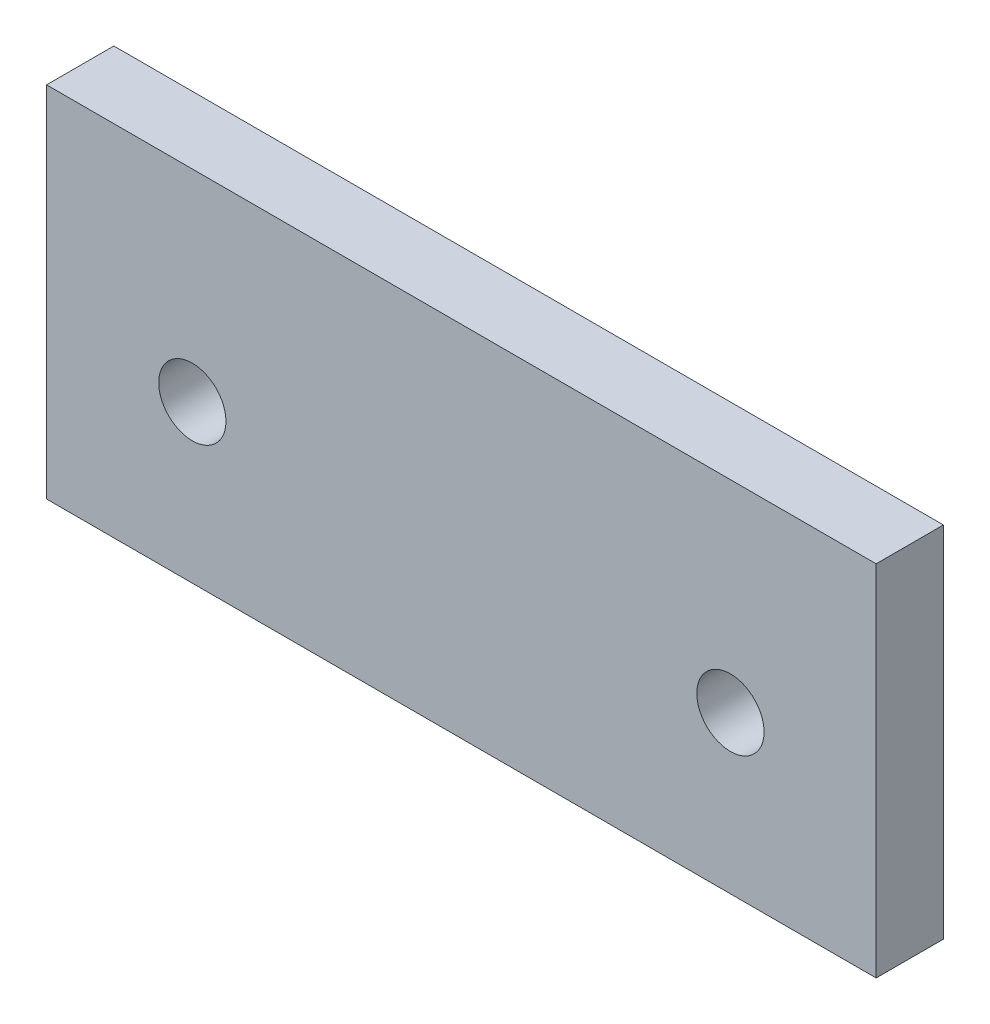
ISO-10303-21;
HEADER;
FILE_DESCRIPTION(('STEP AP214'),'2;1');
FILE_NAME('part.step','',(''),(''),'','','');
FILE_SCHEMA(('AUTOMOTIVE_DESIGN { 1 0 10303 214 1 1 1 1 }'));
ENDSEC;
DATA;
#1=APPLICATION_CONTEXT('core data for automotive mechanical design processes');
#2=APPLICATION_PROTOCOL_DEFINITION('international standard','automotive_design',2000,#1);
#3=PRODUCT_CONTEXT('',#1,'mechanical');
#4=PRODUCT('Part','Part','',(#3));
#5=PRODUCT_RELATED_PRODUCT_CATEGORY('part','',(#4));
#6=PRODUCT_DEFINITION_FORMATION('','',#4);
#7=PRODUCT_DEFINITION_CONTEXT('part definition',#1,'design');
#8=PRODUCT_DEFINITION('design','',#6,#7);
#9=PRODUCT_DEFINITION_SHAPE('','',#8);
#10=(LENGTH_UNIT() NAMED_UNIT(*) SI_UNIT(.MILLI.,.METRE.));
#11=(NAMED_UNIT(*) PLANE_ANGLE_UNIT() SI_UNIT($,.RADIAN.));
#12=(NAMED_UNIT(*) SI_UNIT($,.STERADIAN.) SOLID_ANGLE_UNIT());
#13=UNCERTAINTY_MEASURE_WITH_UNIT(LENGTH_MEASURE(1.E-05),#10,'distance_accuracy_value','');
#14=(GEOMETRIC_REPRESENTATION_CONTEXT(3) GLOBAL_UNCERTAINTY_ASSIGNED_CONTEXT((#13)) GLOBAL_UNIT_ASSIGNED_CONTEXT((#10,
#11,#12)) REPRESENTATION_CONTEXT('',''));
#15=CARTESIAN_POINT('',(0.,0.,0.));
#16=DIRECTION('',(0.,0.,1.));
#17=DIRECTION('',(1.,0.,0.));
#18=AXIS2_PLACEMENT_3D('',#15,#16,#17);
#19=CARTESIAN_POINT('',(0.,0.,6.));
#20=DIRECTION('',(-1.,0.,0.));
#21=DIRECTION('',(0.,-1.,0.));
#22=AXIS2_PLACEMENT_3D('',#19,#20,#21);
#23=PLANE('',#22);
#24=DIRECTION('',(0.,1.,0.));
#25=VECTOR('',#24,1.);
#26=CARTESIAN_POINT('',(0.,0.,0.));
#27=LINE('',#26,#25);
#28=CARTESIAN_POINT('',(0.,0.,0.));
#29=VERTEX_POINT('',#28);
#30=CARTESIAN_POINT('',(0.,32.,0.));
#31=VERTEX_POINT('',#30);
#32=EDGE_CURVE('E107',#29,#31,#27,.T.);
#33=ORIENTED_EDGE('',*,*,#32,.T.);
#34=DIRECTION('',(0.,0.,-1.));
#35=VECTOR('',#34,1.);
#36=CARTESIAN_POINT('',(0.,32.,6.));
#37=LINE('',#36,#35);
#38=CARTESIAN_POINT('',(0.,32.,6.));
#39=VERTEX_POINT('',#38);
#40=EDGE_CURVE('E11',#39,#31,#37,.T.);
#41=ORIENTED_EDGE('',*,*,#40,.F.);
#42=DIRECTION('',(0.,1.,0.));
#43=VECTOR('',#42,1.);
#44=CARTESIAN_POINT('',(0.,0.,6.));
#45=LINE('',#44,#43);
#46=CARTESIAN_POINT('',(0.,0.,6.));
#47=VERTEX_POINT('',#46);
#48=EDGE_CURVE('E91',#47,#39,#45,.T.);
#49=ORIENTED_EDGE('',*,*,#48,.F.);
#50=DIRECTION('',(0.,0.,-1.));
#51=VECTOR('',#50,1.);
#52=CARTESIAN_POINT('',(0.,0.,6.));
#53=LINE('',#52,#51);
#54=EDGE_CURVE('E103',#47,#29,#53,.T.);
#55=ORIENTED_EDGE('',*,*,#54,.T.);
#56=EDGE_LOOP('',(#33,#41,#49,#55));
#57=FACE_BOUND('',#56,.T.);
#58=ADVANCED_FACE('F39',(#57),#23,.F.);
#59=CARTESIAN_POINT('',(0.,32.,6.));
#60=DIRECTION('',(0.,-1.,0.));
#61=DIRECTION('',(1.,0.,0.));
#62=AXIS2_PLACEMENT_3D('',#59,#60,#61);
#63=PLANE('',#62);
#64=DIRECTION('',(-1.,0.,0.));
#65=VECTOR('',#64,1.);
#66=CARTESIAN_POINT('',(0.,32.,0.));
#67=LINE('',#66,#65);
#68=CARTESIAN_POINT('',(-74.,32.,0.));
#69=VERTEX_POINT('',#68);
#70=EDGE_CURVE('E96',#31,#69,#67,.T.);
#71=ORIENTED_EDGE('',*,*,#70,.T.);
#72=DIRECTION('',(0.,0.,-1.));
#73=VECTOR('',#72,1.);
#74=CARTESIAN_POINT('',(-74.,32.,6.));
#75=LINE('',#74,#73);
#76=CARTESIAN_POINT('',(-74.,32.,6.));
#77=VERTEX_POINT('',#76);
#78=EDGE_CURVE('E48',#77,#69,#75,.T.);
#79=ORIENTED_EDGE('',*,*,#78,.F.);
#80=DIRECTION('',(-1.,0.,0.));
#81=VECTOR('',#80,1.);
#82=CARTESIAN_POINT('',(0.,32.,6.));
#83=LINE('',#82,#81);
#84=EDGE_CURVE('E86',#39,#77,#83,.T.);
#85=ORIENTED_EDGE('',*,*,#84,.F.);
#86=ORIENTED_EDGE('',*,*,#40,.T.);
#87=EDGE_LOOP('',(#71,#79,#85,#86));
#88=FACE_BOUND('',#87,.T.);
#89=ADVANCED_FACE('F95',(#88),#63,.F.);
#90=CARTESIAN_POINT('',(-74.,0.,6.));
#91=DIRECTION('',(1.,0.,0.));
#92=DIRECTION('',(0.,0.,-1.));
#93=AXIS2_PLACEMENT_3D('',#90,#91,#92);
#94=PLANE('',#93);
#95=DIRECTION('',(0.,-1.,0.));
#96=VECTOR('',#95,1.);
#97=CARTESIAN_POINT('',(-74.,0.,0.));
#98=LINE('',#97,#96);
#99=CARTESIAN_POINT('',(-74.,0.,0.));
#100=VERTEX_POINT('',#99);
#101=EDGE_CURVE('E73',#69,#100,#98,.T.);
#102=ORIENTED_EDGE('',*,*,#101,.T.);
#103=DIRECTION('',(0.,0.,-1.));
#104=VECTOR('',#103,1.);
#105=CARTESIAN_POINT('',(-74.,0.,6.));
#106=LINE('',#105,#104);
#107=CARTESIAN_POINT('',(-74.,0.,6.));
#108=VERTEX_POINT('',#107);
#109=EDGE_CURVE('E98',#108,#100,#106,.T.);
#110=ORIENTED_EDGE('',*,*,#109,.F.);
#111=DIRECTION('',(0.,-1.,0.));
#112=VECTOR('',#111,1.);
#113=CARTESIAN_POINT('',(-74.,0.,6.));
#114=LINE('',#113,#112);
#115=EDGE_CURVE('E89',#77,#108,#114,.T.);
#116=ORIENTED_EDGE('',*,*,#115,.F.);
#117=ORIENTED_EDGE('',*,*,#78,.T.);
#118=EDGE_LOOP('',(#102,#110,#116,#117));
#119=FACE_BOUND('',#118,.T.);
#120=ADVANCED_FACE('F99',(#119),#94,.F.);
#121=CARTESIAN_POINT('',(0.,0.,6.));
#122=DIRECTION('',(0.,1.,0.));
#123=DIRECTION('',(-1.,0.,0.));
#124=AXIS2_PLACEMENT_3D('',#121,#122,#123);
#125=PLANE('',#124);
#126=DIRECTION('',(1.,0.,0.));
#127=VECTOR('',#126,1.);
#128=CARTESIAN_POINT('',(0.,0.,0.));
#129=LINE('',#128,#127);
#130=EDGE_CURVE('E79',#100,#29,#129,.T.);
#131=ORIENTED_EDGE('',*,*,#130,.T.);
#132=ORIENTED_EDGE('',*,*,#54,.F.);
#133=DIRECTION('',(1.,0.,0.));
#134=VECTOR('',#133,1.);
#135=CARTESIAN_POINT('',(0.,0.,6.));
#136=LINE('',#135,#134);
#137=EDGE_CURVE('E56',#108,#47,#136,.T.);
#138=ORIENTED_EDGE('',*,*,#137,.F.);
#139=ORIENTED_EDGE('',*,*,#109,.T.);
#140=EDGE_LOOP('',(#131,#132,#138,#139));
#141=FACE_BOUND('',#140,.T.);
#142=ADVANCED_FACE('F121',(#141),#125,.F.);
#143=CARTESIAN_POINT('',(0.,0.,6.));
#144=DIRECTION('',(0.,0.,1.));
#145=DIRECTION('',(1.,0.,0.));
#146=AXIS2_PLACEMENT_3D('',#143,#144,#145);
#147=PLANE('',#146);
#148=CARTESIAN_POINT('',(-13.,14.,6.));
#149=DIRECTION('',(0.,0.,1.));
#150=DIRECTION('',(1.,0.,0.));
#151=AXIS2_PLACEMENT_3D('',#148,#149,#150);
#152=CIRCLE('',#151,3.);
#153=CARTESIAN_POINT('',(-10.,14.,6.));
#154=VERTEX_POINT('',#153);
#155=EDGE_CURVE('E136',#154,#154,#152,.T.);
#156=ORIENTED_EDGE('',*,*,#155,.F.);
#157=EDGE_LOOP('',(#156));
#158=FACE_BOUND('',#157,.T.);
#159=CARTESIAN_POINT('',(-61.,14.,6.));
#160=DIRECTION('',(0.,0.,1.));
#161=DIRECTION('',(1.,0.,0.));
#162=AXIS2_PLACEMENT_3D('',#159,#160,#161);
#163=CIRCLE('',#162,3.);
#164=CARTESIAN_POINT('',(-58.,14.,6.));
#165=VERTEX_POINT('',#164);
#166=EDGE_CURVE('E128',#165,#165,#163,.T.);
#167=ORIENTED_EDGE('',*,*,#166,.F.);
#168=EDGE_LOOP('',(#167));
#169=FACE_BOUND('',#168,.T.);
#170=ORIENTED_EDGE('',*,*,#48,.T.);
#171=ORIENTED_EDGE('',*,*,#84,.T.);
#172=ORIENTED_EDGE('',*,*,#115,.T.);
#173=ORIENTED_EDGE('',*,*,#137,.T.);
#174=EDGE_LOOP('',(#170,#171,#172,#173));
#175=FACE_BOUND('',#174,.T.);
#176=ADVANCED_FACE('F87',(#158,#169,#175),#147,.T.);
#177=CARTESIAN_POINT('',(0.,0.,0.));
#178=DIRECTION('',(0.,0.,1.));
#179=DIRECTION('',(1.,0.,0.));
#180=AXIS2_PLACEMENT_3D('',#177,#178,#179);
#181=PLANE('',#180);
#182=CARTESIAN_POINT('',(-13.,14.,0.));
#183=DIRECTION('',(0.,0.,1.));
#184=DIRECTION('',(1.,0.,0.));
#185=AXIS2_PLACEMENT_3D('',#182,#183,#184);
#186=CIRCLE('',#185,3.);
#187=CARTESIAN_POINT('',(-10.,14.,0.));
#188=VERTEX_POINT('',#187);
#189=EDGE_CURVE('E111',#188,#188,#186,.T.);
#190=ORIENTED_EDGE('',*,*,#189,.T.);
#191=EDGE_LOOP('',(#190));
#192=FACE_BOUND('',#191,.T.);
#193=CARTESIAN_POINT('',(-61.,14.,0.));
#194=DIRECTION('',(0.,0.,1.));
#195=DIRECTION('',(1.,0.,0.));
#196=AXIS2_PLACEMENT_3D('',#193,#194,#195);
#197=CIRCLE('',#196,3.);
#198=CARTESIAN_POINT('',(-58.,14.,0.));
#199=VERTEX_POINT('',#198);
#200=EDGE_CURVE('E132',#199,#199,#197,.T.);
#201=ORIENTED_EDGE('',*,*,#200,.T.);
#202=EDGE_LOOP('',(#201));
#203=FACE_BOUND('',#202,.T.);
#204=ORIENTED_EDGE('',*,*,#32,.F.);
#205=ORIENTED_EDGE('',*,*,#130,.F.);
#206=ORIENTED_EDGE('',*,*,#101,.F.);
#207=ORIENTED_EDGE('',*,*,#70,.F.);
#208=EDGE_LOOP('',(#204,#205,#206,#207));
#209=FACE_BOUND('',#208,.T.);
#210=ADVANCED_FACE('F124',(#192,#203,#209),#181,.F.);
#211=CARTESIAN_POINT('',(-61.,14.,0.));
#212=DIRECTION('',(0.,0.,1.));
#213=DIRECTION('',(1.,0.,0.));
#214=AXIS2_PLACEMENT_3D('',#211,#212,#213);
#215=CYLINDRICAL_SURFACE('',#214,3.);
#216=ORIENTED_EDGE('',*,*,#200,.F.);
#217=EDGE_LOOP('',(#216));
#218=FACE_BOUND('',#217,.T.);
#219=ORIENTED_EDGE('',*,*,#166,.T.);
#220=EDGE_LOOP('',(#219));
#221=FACE_BOUND('',#220,.T.);
#222=ADVANCED_FACE('F149',(#218,#221),#215,.F.);
#223=CARTESIAN_POINT('',(-13.,14.,0.));
#224=DIRECTION('',(0.,0.,1.));
#225=DIRECTION('',(1.,0.,0.));
#226=AXIS2_PLACEMENT_3D('',#223,#224,#225);
#227=CYLINDRICAL_SURFACE('',#226,3.);
#228=ORIENTED_EDGE('',*,*,#189,.F.);
#229=EDGE_LOOP('',(#228));
#230=FACE_BOUND('',#229,.T.);
#231=ORIENTED_EDGE('',*,*,#155,.T.);
#232=EDGE_LOOP('',(#231));
#233=FACE_BOUND('',#232,.T.);
#234=ADVANCED_FACE('F146',(#230,#233),#227,.F.);
#235=CLOSED_SHELL('',(#58,#89,#120,#142,#176,#210,#222,#234));
#236=MANIFOLD_SOLID_BREP('B2',#235);
#237=ADVANCED_BREP_SHAPE_REPRESENTATION('',(#18,#236),#14);
#238=SHAPE_DEFINITION_REPRESENTATION(#9,#237);
ENDSEC;
END-ISO-10303-21;
